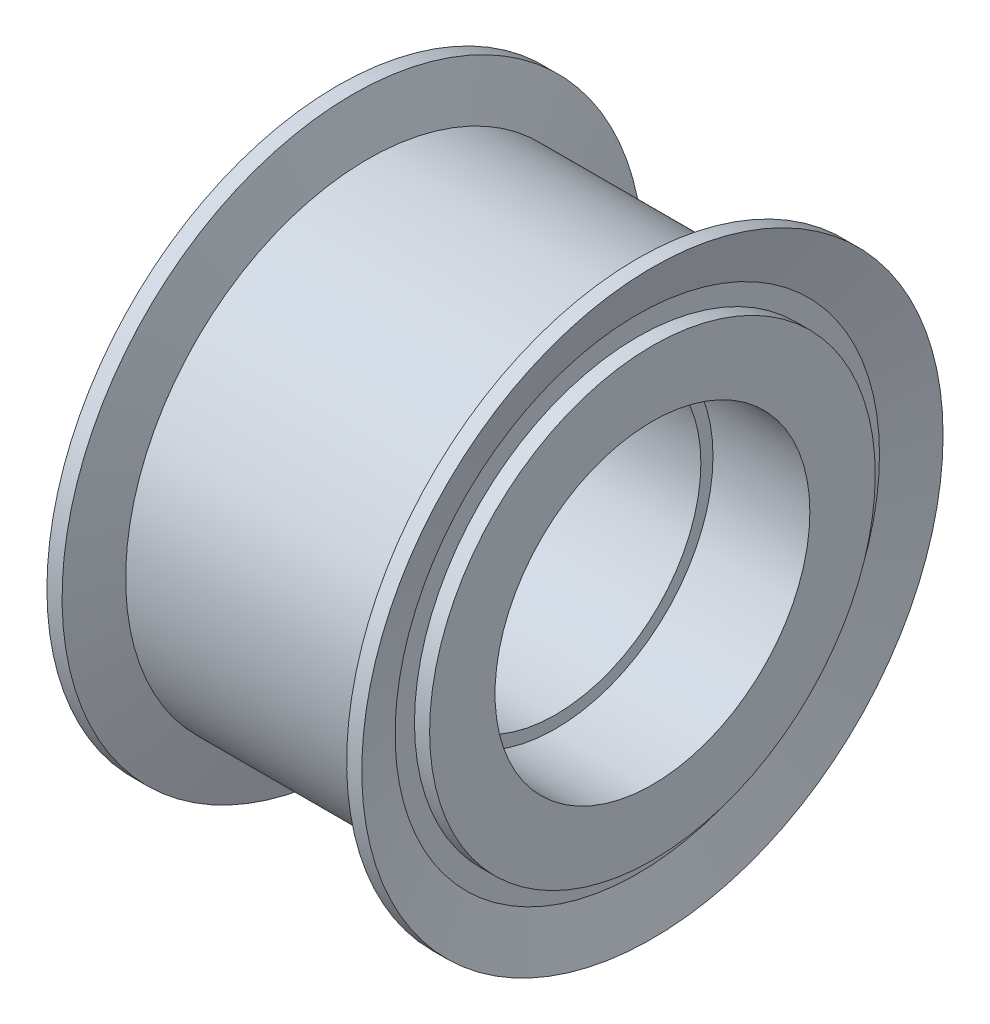
ISO-10303-21;
HEADER;
FILE_DESCRIPTION(('STEP AP214'),'2;1');
FILE_NAME('part.step','',(''),(''),'','','');
FILE_SCHEMA(('AUTOMOTIVE_DESIGN { 1 0 10303 214 1 1 1 1 }'));
ENDSEC;
DATA;
#1=APPLICATION_CONTEXT('core data for automotive mechanical design processes');
#2=APPLICATION_PROTOCOL_DEFINITION('international standard','automotive_design',2000,#1);
#3=PRODUCT_CONTEXT('',#1,'mechanical');
#4=PRODUCT('Part','Part','',(#3));
#5=PRODUCT_RELATED_PRODUCT_CATEGORY('part','',(#4));
#6=PRODUCT_DEFINITION_FORMATION('','',#4);
#7=PRODUCT_DEFINITION_CONTEXT('part definition',#1,'design');
#8=PRODUCT_DEFINITION('design','',#6,#7);
#9=PRODUCT_DEFINITION_SHAPE('','',#8);
#10=(LENGTH_UNIT() NAMED_UNIT(*) SI_UNIT(.MILLI.,.METRE.));
#11=(NAMED_UNIT(*) PLANE_ANGLE_UNIT() SI_UNIT($,.RADIAN.));
#12=(NAMED_UNIT(*) SI_UNIT($,.STERADIAN.) SOLID_ANGLE_UNIT());
#13=UNCERTAINTY_MEASURE_WITH_UNIT(LENGTH_MEASURE(1.E-05),#10,'distance_accuracy_value','');
#14=(GEOMETRIC_REPRESENTATION_CONTEXT(3) GLOBAL_UNCERTAINTY_ASSIGNED_CONTEXT((#13)) GLOBAL_UNIT_ASSIGNED_CONTEXT((#10,
#11,#12)) REPRESENTATION_CONTEXT('',''));
#15=CARTESIAN_POINT('',(0.,0.,0.));
#16=DIRECTION('',(0.,0.,1.));
#17=DIRECTION('',(1.,0.,0.));
#18=AXIS2_PLACEMENT_3D('',#15,#16,#17);
#19=CARTESIAN_POINT('',(0.,0.,0.));
#20=DIRECTION('',(1.,0.,0.));
#21=DIRECTION('',(0.,0.,-1.));
#22=AXIS2_PLACEMENT_3D('',#19,#20,#21);
#23=CYLINDRICAL_SURFACE('',#22,12.);
#24=CARTESIAN_POINT('',(5.,0.,0.));
#25=DIRECTION('',(1.,0.,0.));
#26=DIRECTION('',(0.,0.,-1.));
#27=AXIS2_PLACEMENT_3D('',#24,#25,#26);
#28=CIRCLE('',#27,12.);
#29=CARTESIAN_POINT('',(5.,0.,-12.));
#30=VERTEX_POINT('',#29);
#31=EDGE_CURVE('E18',#30,#30,#28,.F.);
#32=ORIENTED_EDGE('',*,*,#31,.F.);
#33=EDGE_LOOP('',(#32));
#34=FACE_BOUND('',#33,.T.);
#35=CARTESIAN_POINT('',(-5.,0.,0.));
#36=DIRECTION('',(1.,0.,0.));
#37=DIRECTION('',(0.,0.,-1.));
#38=AXIS2_PLACEMENT_3D('',#35,#36,#37);
#39=CIRCLE('',#38,12.);
#40=CARTESIAN_POINT('',(-5.,0.,-12.));
#41=VERTEX_POINT('',#40);
#42=EDGE_CURVE('E72',#41,#41,#39,.T.);
#43=ORIENTED_EDGE('',*,*,#42,.F.);
#44=EDGE_LOOP('',(#43));
#45=FACE_BOUND('',#44,.T.);
#46=ADVANCED_FACE('F15',(#34,#45),#23,.F.);
#47=CARTESIAN_POINT('',(5.,12.5,0.));
#48=DIRECTION('',(1.,0.,0.));
#49=DIRECTION('',(0.,0.,-1.));
#50=AXIS2_PLACEMENT_3D('',#47,#48,#49);
#51=PLANE('',#50);
#52=ORIENTED_EDGE('',*,*,#31,.T.);
#53=EDGE_LOOP('',(#52));
#54=FACE_BOUND('',#53,.T.);
#55=CARTESIAN_POINT('',(5.,0.,0.));
#56=DIRECTION('',(1.,0.,0.));
#57=DIRECTION('',(0.,0.,-1.));
#58=AXIS2_PLACEMENT_3D('',#55,#56,#57);
#59=CIRCLE('',#58,13.);
#60=CARTESIAN_POINT('',(5.,0.,-13.));
#61=VERTEX_POINT('',#60);
#62=EDGE_CURVE('E70',#61,#61,#59,.T.);
#63=ORIENTED_EDGE('',*,*,#62,.T.);
#64=EDGE_LOOP('',(#63));
#65=FACE_BOUND('',#64,.T.);
#66=ADVANCED_FACE('F79',(#54,#65),#51,.T.);
#67=CARTESIAN_POINT('',(-5.,12.5,0.));
#68=DIRECTION('',(-1.,0.,0.));
#69=DIRECTION('',(0.,0.,1.));
#70=AXIS2_PLACEMENT_3D('',#67,#68,#69);
#71=PLANE('',#70);
#72=CARTESIAN_POINT('',(-5.,0.,0.));
#73=DIRECTION('',(1.,0.,0.));
#74=DIRECTION('',(0.,0.,-1.));
#75=AXIS2_PLACEMENT_3D('',#72,#73,#74);
#76=CIRCLE('',#75,13.);
#77=CARTESIAN_POINT('',(-5.,0.,-13.));
#78=VERTEX_POINT('',#77);
#79=EDGE_CURVE('E67',#78,#78,#76,.F.);
#80=ORIENTED_EDGE('',*,*,#79,.T.);
#81=EDGE_LOOP('',(#80));
#82=FACE_BOUND('',#81,.T.);
#83=ORIENTED_EDGE('',*,*,#42,.T.);
#84=EDGE_LOOP('',(#83));
#85=FACE_BOUND('',#84,.T.);
#86=ADVANCED_FACE('F88',(#82,#85),#71,.T.);
#87=CARTESIAN_POINT('',(9.,0.,0.));
#88=DIRECTION('',(1.,0.,0.));
#89=DIRECTION('',(0.,0.,-1.));
#90=AXIS2_PLACEMENT_3D('',#87,#88,#89);
#91=CYLINDRICAL_SURFACE('',#90,13.);
#92=CARTESIAN_POINT('',(13.,0.,0.));
#93=DIRECTION('',(1.,0.,0.));
#94=DIRECTION('',(0.,0.,-1.));
#95=AXIS2_PLACEMENT_3D('',#92,#93,#94);
#96=CIRCLE('',#95,13.);
#97=CARTESIAN_POINT('',(13.,0.,-13.));
#98=VERTEX_POINT('',#97);
#99=EDGE_CURVE('E64',#98,#98,#96,.F.);
#100=ORIENTED_EDGE('',*,*,#99,.F.);
#101=EDGE_LOOP('',(#100));
#102=FACE_BOUND('',#101,.T.);
#103=ORIENTED_EDGE('',*,*,#62,.F.);
#104=EDGE_LOOP('',(#103));
#105=FACE_BOUND('',#104,.T.);
#106=ADVANCED_FACE('F147',(#102,#105),#91,.F.);
#107=CARTESIAN_POINT('',(-9.,0.,0.));
#108=DIRECTION('',(1.,0.,0.));
#109=DIRECTION('',(0.,0.,-1.));
#110=AXIS2_PLACEMENT_3D('',#107,#108,#109);
#111=CYLINDRICAL_SURFACE('',#110,13.);
#112=ORIENTED_EDGE('',*,*,#79,.F.);
#113=EDGE_LOOP('',(#112));
#114=FACE_BOUND('',#113,.T.);
#115=CARTESIAN_POINT('',(-13.,0.,0.));
#116=DIRECTION('',(1.,0.,0.));
#117=DIRECTION('',(0.,0.,-1.));
#118=AXIS2_PLACEMENT_3D('',#115,#116,#117);
#119=CIRCLE('',#118,13.);
#120=CARTESIAN_POINT('',(-13.,0.,-13.));
#121=VERTEX_POINT('',#120);
#122=EDGE_CURVE('E61',#121,#121,#119,.T.);
#123=ORIENTED_EDGE('',*,*,#122,.F.);
#124=EDGE_LOOP('',(#123));
#125=FACE_BOUND('',#124,.T.);
#126=ADVANCED_FACE('F143',(#114,#125),#111,.F.);
#127=CARTESIAN_POINT('',(13.,15.7,0.));
#128=DIRECTION('',(1.,0.,0.));
#129=DIRECTION('',(0.,0.,-1.));
#130=AXIS2_PLACEMENT_3D('',#127,#128,#129);
#131=PLANE('',#130);
#132=ORIENTED_EDGE('',*,*,#99,.T.);
#133=EDGE_LOOP('',(#132));
#134=FACE_BOUND('',#133,.T.);
#135=CARTESIAN_POINT('',(13.,0.,0.));
#136=DIRECTION('',(1.,0.,0.));
#137=DIRECTION('',(0.,0.,-1.));
#138=AXIS2_PLACEMENT_3D('',#135,#136,#137);
#139=CIRCLE('',#138,18.4);
#140=CARTESIAN_POINT('',(13.,0.,-18.4));
#141=VERTEX_POINT('',#140);
#142=EDGE_CURVE('E58',#141,#141,#139,.F.);
#143=ORIENTED_EDGE('',*,*,#142,.F.);
#144=EDGE_LOOP('',(#143));
#145=FACE_BOUND('',#144,.T.);
#146=ADVANCED_FACE('F139',(#134,#145),#131,.T.);
#147=CARTESIAN_POINT('',(-13.,15.7,0.));
#148=DIRECTION('',(-1.,0.,0.));
#149=DIRECTION('',(0.,0.,1.));
#150=AXIS2_PLACEMENT_3D('',#147,#148,#149);
#151=PLANE('',#150);
#152=CARTESIAN_POINT('',(-13.,0.,0.));
#153=DIRECTION('',(1.,0.,0.));
#154=DIRECTION('',(0.,0.,-1.));
#155=AXIS2_PLACEMENT_3D('',#152,#153,#154);
#156=CIRCLE('',#155,18.4);
#157=CARTESIAN_POINT('',(-13.,0.,-18.4));
#158=VERTEX_POINT('',#157);
#159=EDGE_CURVE('E55',#158,#158,#156,.T.);
#160=ORIENTED_EDGE('',*,*,#159,.F.);
#161=EDGE_LOOP('',(#160));
#162=FACE_BOUND('',#161,.T.);
#163=ORIENTED_EDGE('',*,*,#122,.T.);
#164=EDGE_LOOP('',(#163));
#165=FACE_BOUND('',#164,.T.);
#166=ADVANCED_FACE('F135',(#162,#165),#151,.T.);
#167=CARTESIAN_POINT('',(12.375,0.,0.));
#168=DIRECTION('',(1.,0.,0.));
#169=DIRECTION('',(0.,0.,-1.));
#170=AXIS2_PLACEMENT_3D('',#167,#168,#169);
#171=CYLINDRICAL_SURFACE('',#170,18.4);
#172=CARTESIAN_POINT('',(11.75,0.,0.));
#173=DIRECTION('',(1.,0.,0.));
#174=DIRECTION('',(0.,0.,-1.));
#175=AXIS2_PLACEMENT_3D('',#172,#173,#174);
#176=CIRCLE('',#175,18.4);
#177=CARTESIAN_POINT('',(11.75,0.,-18.4));
#178=VERTEX_POINT('',#177);
#179=EDGE_CURVE('E52',#178,#178,#176,.F.);
#180=ORIENTED_EDGE('',*,*,#179,.F.);
#181=EDGE_LOOP('',(#180));
#182=FACE_BOUND('',#181,.T.);
#183=ORIENTED_EDGE('',*,*,#142,.T.);
#184=EDGE_LOOP('',(#183));
#185=FACE_BOUND('',#184,.T.);
#186=ADVANCED_FACE('F131',(#182,#185),#171,.T.);
#187=CARTESIAN_POINT('',(-12.375,0.,0.));
#188=DIRECTION('',(1.,0.,0.));
#189=DIRECTION('',(0.,0.,-1.));
#190=AXIS2_PLACEMENT_3D('',#187,#188,#189);
#191=CYLINDRICAL_SURFACE('',#190,18.4);
#192=ORIENTED_EDGE('',*,*,#159,.T.);
#193=EDGE_LOOP('',(#192));
#194=FACE_BOUND('',#193,.T.);
#195=CARTESIAN_POINT('',(-11.75,0.,0.));
#196=DIRECTION('',(1.,0.,0.));
#197=DIRECTION('',(0.,0.,-1.));
#198=AXIS2_PLACEMENT_3D('',#195,#196,#197);
#199=CIRCLE('',#198,18.4);
#200=CARTESIAN_POINT('',(-11.75,0.,-18.4));
#201=VERTEX_POINT('',#200);
#202=EDGE_CURVE('E49',#201,#201,#199,.T.);
#203=ORIENTED_EDGE('',*,*,#202,.F.);
#204=EDGE_LOOP('',(#203));
#205=FACE_BOUND('',#204,.T.);
#206=ADVANCED_FACE('F127',(#194,#205),#191,.T.);
#207=CARTESIAN_POINT('',(11.75,19.2,0.));
#208=DIRECTION('',(1.,0.,0.));
#209=DIRECTION('',(0.,0.,-1.));
#210=AXIS2_PLACEMENT_3D('',#207,#208,#209);
#211=PLANE('',#210);
#212=ORIENTED_EDGE('',*,*,#179,.T.);
#213=EDGE_LOOP('',(#212));
#214=FACE_BOUND('',#213,.T.);
#215=CARTESIAN_POINT('',(11.75,0.,0.));
#216=DIRECTION('',(1.,0.,0.));
#217=DIRECTION('',(0.,0.,-1.));
#218=AXIS2_PLACEMENT_3D('',#215,#216,#217);
#219=CIRCLE('',#218,20.);
#220=CARTESIAN_POINT('',(11.75,0.,-20.));
#221=VERTEX_POINT('',#220);
#222=EDGE_CURVE('E46',#221,#221,#219,.T.);
#223=ORIENTED_EDGE('',*,*,#222,.T.);
#224=EDGE_LOOP('',(#223));
#225=FACE_BOUND('',#224,.T.);
#226=ADVANCED_FACE('F123',(#214,#225),#211,.T.);
#227=CARTESIAN_POINT('',(-11.75,19.2,0.));
#228=DIRECTION('',(-1.,0.,0.));
#229=DIRECTION('',(0.,0.,1.));
#230=AXIS2_PLACEMENT_3D('',#227,#228,#229);
#231=PLANE('',#230);
#232=CARTESIAN_POINT('',(-11.75,0.,0.));
#233=DIRECTION('',(-1.,0.,0.));
#234=DIRECTION('',(0.,0.,1.));
#235=AXIS2_PLACEMENT_3D('',#232,#233,#234);
#236=CIRCLE('',#235,20.);
#237=CARTESIAN_POINT('',(-11.75,0.,20.));
#238=VERTEX_POINT('',#237);
#239=EDGE_CURVE('E41',#238,#238,#236,.T.);
#240=ORIENTED_EDGE('',*,*,#239,.T.);
#241=EDGE_LOOP('',(#240));
#242=FACE_BOUND('',#241,.T.);
#243=ORIENTED_EDGE('',*,*,#202,.T.);
#244=EDGE_LOOP('',(#243));
#245=FACE_BOUND('',#244,.T.);
#246=ADVANCED_FACE('F119',(#242,#245),#231,.T.);
#247=CARTESIAN_POINT('',(13.,0.,0.));
#248=DIRECTION('',(1.,0.,0.));
#249=DIRECTION('',(0.,0.,-1.));
#250=AXIS2_PLACEMENT_3D('',#247,#248,#249);
#251=CONICAL_SURFACE('',#250,24.,1.26791145841993);
#252=ORIENTED_EDGE('',*,*,#222,.F.);
#253=EDGE_LOOP('',(#252));
#254=FACE_BOUND('',#253,.T.);
#255=CARTESIAN_POINT('',(13.,0.,0.));
#256=DIRECTION('',(1.,0.,0.));
#257=DIRECTION('',(0.,0.,-1.));
#258=AXIS2_PLACEMENT_3D('',#255,#256,#257);
#259=CIRCLE('',#258,24.);
#260=CARTESIAN_POINT('',(13.,0.,-24.));
#261=VERTEX_POINT('',#260);
#262=EDGE_CURVE('E38',#261,#261,#259,.F.);
#263=ORIENTED_EDGE('',*,*,#262,.F.);
#264=EDGE_LOOP('',(#263));
#265=FACE_BOUND('',#264,.T.);
#266=ADVANCED_FACE('F115',(#254,#265),#251,.F.);
#267=CARTESIAN_POINT('',(-13.,0.,0.));
#268=DIRECTION('',(-1.,0.,0.));
#269=DIRECTION('',(0.,0.,1.));
#270=AXIS2_PLACEMENT_3D('',#267,#268,#269);
#271=CONICAL_SURFACE('',#270,24.,1.26791145841993);
#272=CARTESIAN_POINT('',(-13.,0.,0.));
#273=DIRECTION('',(1.,0.,0.));
#274=DIRECTION('',(0.,0.,-1.));
#275=AXIS2_PLACEMENT_3D('',#272,#273,#274);
#276=CIRCLE('',#275,24.);
#277=CARTESIAN_POINT('',(-13.,0.,-24.));
#278=VERTEX_POINT('',#277);
#279=EDGE_CURVE('E35',#278,#278,#276,.T.);
#280=ORIENTED_EDGE('',*,*,#279,.F.);
#281=EDGE_LOOP('',(#280));
#282=FACE_BOUND('',#281,.T.);
#283=ORIENTED_EDGE('',*,*,#239,.F.);
#284=EDGE_LOOP('',(#283));
#285=FACE_BOUND('',#284,.T.);
#286=ADVANCED_FACE('F111',(#282,#285),#271,.F.);
#287=CARTESIAN_POINT('',(12.375,0.,0.));
#288=DIRECTION('',(1.,0.,0.));
#289=DIRECTION('',(0.,0.,-1.));
#290=AXIS2_PLACEMENT_3D('',#287,#288,#289);
#291=CYLINDRICAL_SURFACE('',#290,24.);
#292=ORIENTED_EDGE('',*,*,#262,.T.);
#293=EDGE_LOOP('',(#292));
#294=FACE_BOUND('',#293,.T.);
#295=CARTESIAN_POINT('',(11.75,0.,0.));
#296=DIRECTION('',(1.,0.,0.));
#297=DIRECTION('',(0.,1.,0.));
#298=AXIS2_PLACEMENT_3D('',#295,#296,#297);
#299=CIRCLE('',#298,24.);
#300=CARTESIAN_POINT('',(11.75,24.,0.));
#301=VERTEX_POINT('',#300);
#302=EDGE_CURVE('E32',#301,#301,#299,.F.);
#303=ORIENTED_EDGE('',*,*,#302,.F.);
#304=EDGE_LOOP('',(#303));
#305=FACE_BOUND('',#304,.T.);
#306=ADVANCED_FACE('F107',(#294,#305),#291,.T.);
#307=CARTESIAN_POINT('',(-12.375,0.,0.));
#308=DIRECTION('',(1.,0.,0.));
#309=DIRECTION('',(0.,0.,-1.));
#310=AXIS2_PLACEMENT_3D('',#307,#308,#309);
#311=CYLINDRICAL_SURFACE('',#310,24.);
#312=ORIENTED_EDGE('',*,*,#279,.T.);
#313=EDGE_LOOP('',(#312));
#314=FACE_BOUND('',#313,.T.);
#315=CARTESIAN_POINT('',(-11.75,0.,0.));
#316=DIRECTION('',(-1.,0.,0.));
#317=DIRECTION('',(0.,1.,0.));
#318=AXIS2_PLACEMENT_3D('',#315,#316,#317);
#319=CIRCLE('',#318,24.);
#320=CARTESIAN_POINT('',(-11.75,24.,0.));
#321=VERTEX_POINT('',#320);
#322=EDGE_CURVE('E27',#321,#321,#319,.F.);
#323=ORIENTED_EDGE('',*,*,#322,.F.);
#324=EDGE_LOOP('',(#323));
#325=FACE_BOUND('',#324,.T.);
#326=ADVANCED_FACE('F103',(#314,#325),#311,.T.);
#327=CARTESIAN_POINT('',(11.75,0.,0.));
#328=DIRECTION('',(1.,0.,0.));
#329=DIRECTION('',(0.,0.,-1.));
#330=AXIS2_PLACEMENT_3D('',#327,#328,#329);
#331=CONICAL_SURFACE('',#330,24.,1.26791145841993);
#332=ORIENTED_EDGE('',*,*,#302,.T.);
#333=EDGE_LOOP('',(#332));
#334=FACE_BOUND('',#333,.T.);
#335=CARTESIAN_POINT('',(10.5,0.,0.));
#336=DIRECTION('',(1.,0.,0.));
#337=DIRECTION('',(0.,0.,-1.));
#338=AXIS2_PLACEMENT_3D('',#335,#336,#337);
#339=CIRCLE('',#338,20.);
#340=CARTESIAN_POINT('',(10.5,0.,-20.));
#341=VERTEX_POINT('',#340);
#342=EDGE_CURVE('E22',#341,#341,#339,.F.);
#343=ORIENTED_EDGE('',*,*,#342,.F.);
#344=EDGE_LOOP('',(#343));
#345=FACE_BOUND('',#344,.T.);
#346=ADVANCED_FACE('F97',(#334,#345),#331,.T.);
#347=CARTESIAN_POINT('',(-11.75,0.,0.));
#348=DIRECTION('',(-1.,0.,0.));
#349=DIRECTION('',(0.,0.,1.));
#350=AXIS2_PLACEMENT_3D('',#347,#348,#349);
#351=CONICAL_SURFACE('',#350,24.,1.26791145841993);
#352=CARTESIAN_POINT('',(-10.5,0.,0.));
#353=DIRECTION('',(1.,0.,0.));
#354=DIRECTION('',(0.,0.,-1.));
#355=AXIS2_PLACEMENT_3D('',#352,#353,#354);
#356=CIRCLE('',#355,20.);
#357=CARTESIAN_POINT('',(-10.5,0.,-20.));
#358=VERTEX_POINT('',#357);
#359=EDGE_CURVE('E10',#358,#358,#356,.T.);
#360=ORIENTED_EDGE('',*,*,#359,.F.);
#361=EDGE_LOOP('',(#360));
#362=FACE_BOUND('',#361,.T.);
#363=ORIENTED_EDGE('',*,*,#322,.T.);
#364=EDGE_LOOP('',(#363));
#365=FACE_BOUND('',#364,.T.);
#366=ADVANCED_FACE('F91',(#362,#365),#351,.T.);
#367=CARTESIAN_POINT('',(0.,0.,0.));
#368=DIRECTION('',(1.,0.,0.));
#369=DIRECTION('',(0.,0.,-1.));
#370=AXIS2_PLACEMENT_3D('',#367,#368,#369);
#371=CYLINDRICAL_SURFACE('',#370,20.);
#372=ORIENTED_EDGE('',*,*,#342,.T.);
#373=EDGE_LOOP('',(#372));
#374=FACE_BOUND('',#373,.T.);
#375=ORIENTED_EDGE('',*,*,#359,.T.);
#376=EDGE_LOOP('',(#375));
#377=FACE_BOUND('',#376,.T.);
#378=ADVANCED_FACE('F89',(#374,#377),#371,.T.);
#379=CLOSED_SHELL('',(#46,#66,#86,#106,#126,#146,#166,#186,#206,#226,#246,#266,#286,#306,#326,
#346,#366,#378));
#380=MANIFOLD_SOLID_BREP('B1',#379);
#381=ADVANCED_BREP_SHAPE_REPRESENTATION('',(#18,#380),#14);
#382=SHAPE_DEFINITION_REPRESENTATION(#9,#381);
ENDSEC;
END-ISO-10303-21;
